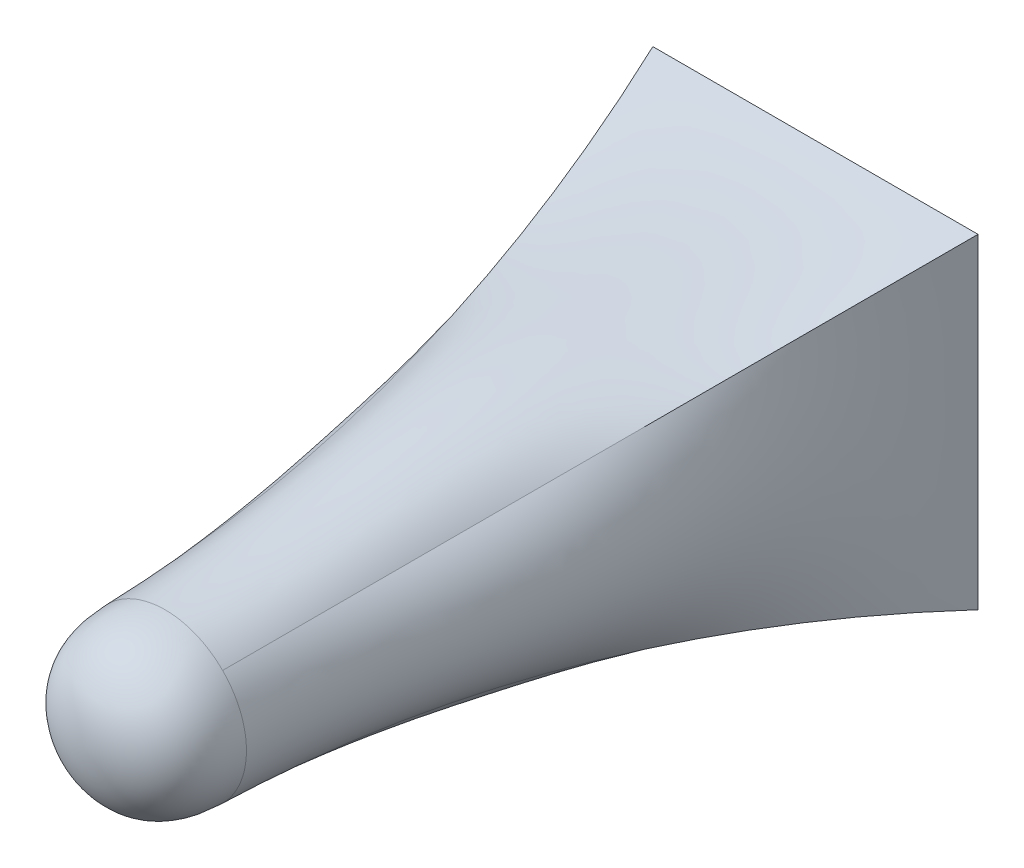
ISO-10303-21;
HEADER;
FILE_DESCRIPTION(('STEP AP214'),'2;1');
FILE_NAME('part.step','',(''),(''),'','','');
FILE_SCHEMA(('AUTOMOTIVE_DESIGN { 1 0 10303 214 1 1 1 1 }'));
ENDSEC;
DATA;
#1=APPLICATION_CONTEXT('core data for automotive mechanical design processes');
#2=APPLICATION_PROTOCOL_DEFINITION('international standard','automotive_design',2000,#1);
#3=PRODUCT_CONTEXT('',#1,'mechanical');
#4=PRODUCT('Part','Part','',(#3));
#5=PRODUCT_RELATED_PRODUCT_CATEGORY('part','',(#4));
#6=PRODUCT_DEFINITION_FORMATION('','',#4);
#7=PRODUCT_DEFINITION_CONTEXT('part definition',#1,'design');
#8=PRODUCT_DEFINITION('design','',#6,#7);
#9=PRODUCT_DEFINITION_SHAPE('','',#8);
#10=(LENGTH_UNIT() NAMED_UNIT(*) SI_UNIT(.MILLI.,.METRE.));
#11=(NAMED_UNIT(*) PLANE_ANGLE_UNIT() SI_UNIT($,.RADIAN.));
#12=(NAMED_UNIT(*) SI_UNIT($,.STERADIAN.) SOLID_ANGLE_UNIT());
#13=UNCERTAINTY_MEASURE_WITH_UNIT(LENGTH_MEASURE(1.E-05),#10,'distance_accuracy_value','');
#14=(GEOMETRIC_REPRESENTATION_CONTEXT(3) GLOBAL_UNCERTAINTY_ASSIGNED_CONTEXT((#13)) GLOBAL_UNIT_ASSIGNED_CONTEXT((#10,
#11,#12)) REPRESENTATION_CONTEXT('',''));
#15=CARTESIAN_POINT('',(0.,0.,0.));
#16=DIRECTION('',(0.,0.,1.));
#17=DIRECTION('',(1.,0.,0.));
#18=AXIS2_PLACEMENT_3D('',#15,#16,#17);
#19=CARTESIAN_POINT('',(0.,0.,0.));
#20=DIRECTION('',(0.,0.,-1.));
#21=DIRECTION('',(-1.,0.,0.));
#22=AXIS2_PLACEMENT_3D('',#19,#20,#21);
#23=PLANE('',#22);
#24=DIRECTION('',(-1.,0.,0.));
#25=VECTOR('',#24,1.);
#26=CARTESIAN_POINT('',(6.35,6.35,0.));
#27=LINE('',#26,#25);
#28=CARTESIAN_POINT('',(6.35,6.35,0.));
#29=VERTEX_POINT('',#28);
#30=CARTESIAN_POINT('',(-6.35,6.35,0.));
#31=VERTEX_POINT('',#30);
#32=EDGE_CURVE('E267',#29,#31,#27,.T.);
#33=ORIENTED_EDGE('',*,*,#32,.F.);
#34=DIRECTION('',(0.,1.,0.));
#35=VECTOR('',#34,1.);
#36=CARTESIAN_POINT('',(6.35,-6.35,0.));
#37=LINE('',#36,#35);
#38=CARTESIAN_POINT('',(6.35,-6.35,0.));
#39=VERTEX_POINT('',#38);
#40=EDGE_CURVE('E249',#39,#29,#37,.T.);
#41=ORIENTED_EDGE('',*,*,#40,.F.);
#42=DIRECTION('',(1.,0.,0.));
#43=VECTOR('',#42,1.);
#44=CARTESIAN_POINT('',(6.35,-6.35,0.));
#45=LINE('',#44,#43);
#46=CARTESIAN_POINT('',(-6.35,-6.35,0.));
#47=VERTEX_POINT('',#46);
#48=EDGE_CURVE('E241',#47,#39,#45,.T.);
#49=ORIENTED_EDGE('',*,*,#48,.F.);
#50=DIRECTION('',(0.,-1.,0.));
#51=VECTOR('',#50,1.);
#52=CARTESIAN_POINT('',(-6.35,-6.35,0.));
#53=LINE('',#52,#51);
#54=EDGE_CURVE('E245',#31,#47,#53,.T.);
#55=ORIENTED_EDGE('',*,*,#54,.F.);
#56=EDGE_LOOP('',(#33,#41,#49,#55));
#57=FACE_BOUND('',#56,.T.);
#58=ADVANCED_FACE('F196',(#57),#23,.T.);
#59=CARTESIAN_POINT('',(6.35,-6.35,0.));
#60=CARTESIAN_POINT('',(5.06127510027064,-5.06127510027064,4.13811489977793));
#61=CARTESIAN_POINT('',(3.07297511203779,-3.07297511203779,12.6044846769102));
#62=CARTESIAN_POINT('',(2.32465112044883,-2.32465112044883,21.0714482331113));
#63=CARTESIAN_POINT('',(2.24506403026729,-2.24506403026729,25.4));
#64=CARTESIAN_POINT('',(6.35,-2.11666666666667,0.));
#65=CARTESIAN_POINT('',(5.06127510027064,-1.68709170009021,4.13811489977793));
#66=CARTESIAN_POINT('',(6.15704233241171,-1.6655502562356,12.6044846769102));
#67=CARTESIAN_POINT('',(3.56373565699179,-1.03250852378484,21.0714482331113));
#68=CARTESIAN_POINT('',(3.48414856681025,-1.00597949372432,25.4));
#69=CARTESIAN_POINT('',(6.35,2.11666666666667,0.));
#70=CARTESIAN_POINT('',(5.06127510027064,1.68709170009021,4.13811489977793));
#71=CARTESIAN_POINT('',(6.15704233241171,1.6655502562356,12.6044846769102));
#72=CARTESIAN_POINT('',(3.56373565699179,1.03250852378484,21.0714482331113));
#73=CARTESIAN_POINT('',(3.48414856681025,1.00597949372432,25.4));
#74=CARTESIAN_POINT('',(6.35,6.35,0.));
#75=CARTESIAN_POINT('',(5.06127510027064,5.06127510027064,4.13811489977793));
#76=CARTESIAN_POINT('',(3.07297511203779,3.07297511203779,12.6044846769102));
#77=CARTESIAN_POINT('',(2.32465112044883,2.32465112044883,21.0714482331113));
#78=CARTESIAN_POINT('',(2.24506403026729,2.24506403026729,25.4));
#79=B_SPLINE_SURFACE_WITH_KNOTS('',3,3,((#59,#60,#61,#62,#63),(#64,#65,#66,#67,#68),(#69,#70,
#71,#72,#73),(#74,#75,#76,#77,#78)),.UNSPECIFIED.,.F.,.F.,.F.,(4,4),(4,1,4),(0.,1.),(0.,
0.50563190115092,1.),.UNSPECIFIED.);
#80=CARTESIAN_POINT('',(6.35,6.35,0.));
#81=CARTESIAN_POINT('',(5.06127510027064,5.06127510027064,4.13811489977793));
#82=CARTESIAN_POINT('',(3.07297511203779,3.07297511203779,12.6044846769102));
#83=CARTESIAN_POINT('',(2.32465112044883,2.32465112044883,21.0714482331113));
#84=CARTESIAN_POINT('',(2.24506403026729,2.24506403026729,25.4));
#85=B_SPLINE_CURVE_WITH_KNOTS('',3,(#80,#81,#82,#83,#84),.UNSPECIFIED.,.F.,.F.,(4,1,4),(0.,
0.50563190115092,1.),.UNSPECIFIED.);
#86=CARTESIAN_POINT('',(2.24522607504589,2.2452260750821,25.4000339324606));
#87=VERTEX_POINT('',#86);
#88=EDGE_CURVE('E274',#29,#87,#85,.T.);
#89=CARTESIAN_POINT('',(0.,0.,25.4));
#90=DIRECTION('',(0.,0.,1.));
#91=DIRECTION('',(1.,0.,0.));
#92=AXIS2_PLACEMENT_3D('',#89,#90,#91);
#93=CIRCLE('',#92,3.175);
#94=CARTESIAN_POINT('',(2.24522607525407,-2.24522607335472,25.4000339324615));
#95=VERTEX_POINT('',#94);
#96=EDGE_CURVE('E209',#95,#87,#93,.T.);
#97=CARTESIAN_POINT('',(6.35,-6.35,0.));
#98=CARTESIAN_POINT('',(5.06127510027064,-5.06127510027064,4.13811489977793));
#99=CARTESIAN_POINT('',(3.07297511203779,-3.07297511203779,12.6044846769102));
#100=CARTESIAN_POINT('',(2.32465112044883,-2.32465112044883,21.0714482331113));
#101=CARTESIAN_POINT('',(2.24506403026729,-2.24506403026729,25.4));
#102=B_SPLINE_CURVE_WITH_KNOTS('',3,(#97,#98,#99,#100,#101),.UNSPECIFIED.,.F.,.F.,(4,1,4),(0.,
0.50563190115092,1.),.UNSPECIFIED.);
#103=EDGE_CURVE('E413',#95,#39,#102,.F.);
#104=ORIENTED_EDGE('',*,*,#40,.T.);
#105=ORIENTED_EDGE('',*,*,#88,.T.);
#106=ORIENTED_EDGE('',*,*,#96,.F.);
#107=ORIENTED_EDGE('',*,*,#103,.T.);
#108=EDGE_LOOP('',(#104,#105,#106,#107));
#109=FACE_BOUND('',#108,.T.);
#110=ADVANCED_FACE('F389',(#109),#79,.T.);
#111=CARTESIAN_POINT('',(6.35,6.35,0.));
#112=CARTESIAN_POINT('',(5.06127510027064,5.06127510027064,4.13811489977793));
#113=CARTESIAN_POINT('',(3.07297511203779,3.07297511203779,12.6044846769102));
#114=CARTESIAN_POINT('',(2.32465112044883,2.32465112044883,21.0714482331113));
#115=CARTESIAN_POINT('',(2.24506403026729,2.24506403026729,25.4));
#116=CARTESIAN_POINT('',(2.11666666666667,6.35,0.));
#117=CARTESIAN_POINT('',(1.68709170009021,5.06127510027064,4.13811489977793));
#118=CARTESIAN_POINT('',(1.6655502562356,6.15704233241171,12.6044846769102));
#119=CARTESIAN_POINT('',(1.03250852378484,3.56373565699179,21.0714482331113));
#120=CARTESIAN_POINT('',(1.00597949372432,3.48414856681025,25.4));
#121=CARTESIAN_POINT('',(-2.11666666666667,6.35,0.));
#122=CARTESIAN_POINT('',(-1.68709170009021,5.06127510027064,4.13811489977793));
#123=CARTESIAN_POINT('',(-1.6655502562356,6.15704233241171,12.6044846769102));
#124=CARTESIAN_POINT('',(-1.03250852378484,3.56373565699179,21.0714482331113));
#125=CARTESIAN_POINT('',(-1.00597949372432,3.48414856681025,25.4));
#126=CARTESIAN_POINT('',(-6.35,6.35,0.));
#127=CARTESIAN_POINT('',(-5.06127510027064,5.06127510027064,4.13811489977793));
#128=CARTESIAN_POINT('',(-3.07297511203779,3.07297511203779,12.6044846769102));
#129=CARTESIAN_POINT('',(-2.32465112044883,2.32465112044883,21.0714482331113));
#130=CARTESIAN_POINT('',(-2.24506403026729,2.24506403026729,25.4));
#131=B_SPLINE_SURFACE_WITH_KNOTS('',3,3,((#111,#112,#113,#114,#115),(#116,#117,#118,#119,#120),
(#121,#122,#123,#124,#125),(#126,#127,#128,#129,#130)),.UNSPECIFIED.,.F.,.F.,.F.,(4,4),(4,1,4),
(0.,1.),(0.,0.50563190115092,1.),.UNSPECIFIED.);
#132=CARTESIAN_POINT('',(-6.35,6.35,0.));
#133=CARTESIAN_POINT('',(-5.06127510027064,5.06127510027064,4.13811489977793));
#134=CARTESIAN_POINT('',(-3.07297511203779,3.07297511203779,12.6044846769102));
#135=CARTESIAN_POINT('',(-2.32465112044883,2.32465112044883,21.0714482331113));
#136=CARTESIAN_POINT('',(-2.24506403026729,2.24506403026729,25.4));
#137=B_SPLINE_CURVE_WITH_KNOTS('',3,(#132,#133,#134,#135,#136),.UNSPECIFIED.,.F.,.F.,(4,1,4),
(0.,0.50563190115092,1.),.UNSPECIFIED.);
#138=CARTESIAN_POINT('',(-2.24522607559809,2.24522607377192,25.4000339324445));
#139=VERTEX_POINT('',#138);
#140=EDGE_CURVE('E266',#31,#139,#137,.T.);
#141=EDGE_CURVE('E217',#87,#139,#93,.T.);
#142=ORIENTED_EDGE('',*,*,#32,.T.);
#143=ORIENTED_EDGE('',*,*,#140,.T.);
#144=ORIENTED_EDGE('',*,*,#141,.F.);
#145=ORIENTED_EDGE('',*,*,#88,.F.);
#146=EDGE_LOOP('',(#142,#143,#144,#145));
#147=FACE_BOUND('',#146,.T.);
#148=ADVANCED_FACE('F301',(#147),#131,.T.);
#149=CARTESIAN_POINT('',(-6.35,-6.35,0.));
#150=CARTESIAN_POINT('',(-5.06127510027064,-5.06127510027063,4.13811489977793));
#151=CARTESIAN_POINT('',(-3.07297511203779,-3.07297511203779,12.6044846769102));
#152=CARTESIAN_POINT('',(-2.32465112044883,-2.32465112044883,21.0714482331113));
#153=CARTESIAN_POINT('',(-2.24506403026729,-2.24506403026729,25.4));
#154=CARTESIAN_POINT('',(-2.11666666666667,-6.35,0.));
#155=CARTESIAN_POINT('',(-1.68709170009021,-5.06127510027064,4.13811489977793));
#156=CARTESIAN_POINT('',(-1.6655502562356,-6.15704233241171,12.6044846769102));
#157=CARTESIAN_POINT('',(-1.03250852378484,-3.56373565699179,21.0714482331113));
#158=CARTESIAN_POINT('',(-1.00597949372432,-3.48414856681025,25.4));
#159=CARTESIAN_POINT('',(2.11666666666667,-6.35,0.));
#160=CARTESIAN_POINT('',(1.68709170009021,-5.06127510027064,4.13811489977793));
#161=CARTESIAN_POINT('',(1.6655502562356,-6.15704233241171,12.6044846769102));
#162=CARTESIAN_POINT('',(1.03250852378484,-3.56373565699179,21.0714482331113));
#163=CARTESIAN_POINT('',(1.00597949372432,-3.48414856681025,25.4));
#164=CARTESIAN_POINT('',(6.35,-6.35,0.));
#165=CARTESIAN_POINT('',(5.06127510027063,-5.06127510027064,4.13811489977793));
#166=CARTESIAN_POINT('',(3.07297511203779,-3.07297511203779,12.6044846769102));
#167=CARTESIAN_POINT('',(2.32465112044883,-2.32465112044883,21.0714482331113));
#168=CARTESIAN_POINT('',(2.24506403026729,-2.24506403026729,25.4));
#169=B_SPLINE_SURFACE_WITH_KNOTS('',3,3,((#149,#150,#151,#152,#153),(#154,#155,#156,#157,#158),
(#159,#160,#161,#162,#163),(#164,#165,#166,#167,#168)),.UNSPECIFIED.,.F.,.F.,.F.,(4,4),(4,1,4),
(0.,1.),(0.,0.50563190115092,1.),.UNSPECIFIED.);
#170=CARTESIAN_POINT('',(-2.24522607471502,-2.24522607468922,25.4000339324672));
#171=VERTEX_POINT('',#170);
#172=EDGE_CURVE('E13',#171,#95,#93,.T.);
#173=CARTESIAN_POINT('',(-6.35,-6.35,0.));
#174=CARTESIAN_POINT('',(-5.06127510027063,-5.06127510027063,4.13811489977793));
#175=CARTESIAN_POINT('',(-3.07297511203779,-3.07297511203779,12.6044846769102));
#176=CARTESIAN_POINT('',(-2.32465112044883,-2.32465112044883,21.0714482331113));
#177=CARTESIAN_POINT('',(-2.24506403026729,-2.24506403026729,25.4));
#178=B_SPLINE_CURVE_WITH_KNOTS('',3,(#173,#174,#175,#176,#177),.UNSPECIFIED.,.F.,.F.,(4,1,4),
(0.,0.50563190115092,1.),.UNSPECIFIED.);
#179=EDGE_CURVE('E263',#47,#171,#178,.T.);
#180=ORIENTED_EDGE('',*,*,#48,.T.);
#181=ORIENTED_EDGE('',*,*,#103,.F.);
#182=ORIENTED_EDGE('',*,*,#172,.F.);
#183=ORIENTED_EDGE('',*,*,#179,.F.);
#184=EDGE_LOOP('',(#180,#181,#182,#183));
#185=FACE_BOUND('',#184,.T.);
#186=ADVANCED_FACE('F271',(#185),#169,.T.);
#187=CARTESIAN_POINT('',(-6.35,6.35,0.));
#188=CARTESIAN_POINT('',(-5.06127510027063,5.06127510027063,4.13811489977793));
#189=CARTESIAN_POINT('',(-3.07297511203779,3.07297511203779,12.6044846769102));
#190=CARTESIAN_POINT('',(-2.32465112044883,2.32465112044883,21.0714482331113));
#191=CARTESIAN_POINT('',(-2.24506403026729,2.24506403026729,25.4));
#192=CARTESIAN_POINT('',(-6.35,2.11666666666667,0.));
#193=CARTESIAN_POINT('',(-5.06127510027063,1.68709170009021,4.13811489977793));
#194=CARTESIAN_POINT('',(-6.15704233241171,1.6655502562356,12.6044846769102));
#195=CARTESIAN_POINT('',(-3.56373565699179,1.03250852378484,21.0714482331113));
#196=CARTESIAN_POINT('',(-3.48414856681025,1.00597949372432,25.4));
#197=CARTESIAN_POINT('',(-6.35,-2.11666666666667,0.));
#198=CARTESIAN_POINT('',(-5.06127510027063,-1.68709170009021,4.13811489977793));
#199=CARTESIAN_POINT('',(-6.15704233241171,-1.6655502562356,12.6044846769102));
#200=CARTESIAN_POINT('',(-3.56373565699179,-1.03250852378484,21.0714482331113));
#201=CARTESIAN_POINT('',(-3.48414856681025,-1.00597949372432,25.4));
#202=CARTESIAN_POINT('',(-6.35,-6.35,0.));
#203=CARTESIAN_POINT('',(-5.06127510027063,-5.06127510027063,4.13811489977793));
#204=CARTESIAN_POINT('',(-3.07297511203779,-3.07297511203779,12.6044846769102));
#205=CARTESIAN_POINT('',(-2.32465112044883,-2.32465112044883,21.0714482331113));
#206=CARTESIAN_POINT('',(-2.24506403026729,-2.24506403026729,25.4));
#207=B_SPLINE_SURFACE_WITH_KNOTS('',3,3,((#187,#188,#189,#190,#191),(#192,#193,#194,#195,#196),
(#197,#198,#199,#200,#201),(#202,#203,#204,#205,#206)),.UNSPECIFIED.,.F.,.F.,.F.,(4,4),(4,1,4),
(0.,1.),(0.,0.50563190115092,1.),.UNSPECIFIED.);
#208=EDGE_CURVE('E203',#139,#171,#93,.T.);
#209=ORIENTED_EDGE('',*,*,#54,.T.);
#210=ORIENTED_EDGE('',*,*,#179,.T.);
#211=ORIENTED_EDGE('',*,*,#208,.F.);
#212=ORIENTED_EDGE('',*,*,#140,.F.);
#213=EDGE_LOOP('',(#209,#210,#211,#212));
#214=FACE_BOUND('',#213,.T.);
#215=ADVANCED_FACE('F262',(#214),#207,.T.);
#216=CARTESIAN_POINT('',(-1.91674954754699,-1.91674946867562,21.7430164258834));
#217=CARTESIAN_POINT('',(-2.3107411641466,-1.93275672883131,23.1160294256766));
#218=CARTESIAN_POINT('',(-2.68315143178553,-1.73286010720643,24.1448412705455));
#219=CARTESIAN_POINT('',(-3.01312627323508,-1.27312107382835,24.8297101759092));
#220=CARTESIAN_POINT('',(-3.33652076663534,1.0959656374343E-08,25.5124199925691));
#221=CARTESIAN_POINT('',(-3.01312625976063,1.27312107603764,24.8297101744448));
#222=CARTESIAN_POINT('',(-2.68315131490556,1.73286006481862,24.1448412697847));
#223=CARTESIAN_POINT('',(-2.3107411526117,1.93275676170954,23.1160294278126));
#224=CARTESIAN_POINT('',(-1.91674946867622,1.91674954754622,21.7430164258835));
#225=CARTESIAN_POINT('',(-1.93275672358053,-2.31074115256527,23.1160294278007));
#226=CARTESIAN_POINT('',(-2.31275738287039,-2.31275731886915,24.4892425639475));
#227=CARTESIAN_POINT('',(-2.68150362269254,-2.07722675639881,25.5176800881751));
#228=CARTESIAN_POINT('',(-3.03083768363417,-1.53221911983736,26.2021368413749));
#229=CARTESIAN_POINT('',(-3.3568260293283,-9.45507036346099E-08,26.8830295112565));
#230=CARTESIAN_POINT('',(-3.03083782687522,1.53221922995311,26.202136841737));
#231=CARTESIAN_POINT('',(-2.68150349387909,2.0772265702431,25.5176800854678));
#232=CARTESIAN_POINT('',(-2.31275724123825,2.31275747972071,24.4892425647613));
#233=CARTESIAN_POINT('',(-1.93275669973967,2.31074116299286,23.1160294259844));
#234=CARTESIAN_POINT('',(-1.73286008400415,-2.68315131577158,24.1448412692471));
#235=CARTESIAN_POINT('',(-2.07722648361967,-2.68150339619089,25.5176800914975));
#236=CARTESIAN_POINT('',(-2.43713026355335,-2.43713032622145,26.5440411999355));
#237=CARTESIAN_POINT('',(-2.76905246860003,-1.80194139606624,27.2282005529064));
#238=CARTESIAN_POINT('',(-3.03718353426663,-7.85144516687087E-08,27.9057015547221));
#239=CARTESIAN_POINT('',(-2.76905233176985,1.80194151715747,27.2282005521477));
#240=CARTESIAN_POINT('',(-2.43713059032852,2.43713017688446,26.5440412042488));
#241=CARTESIAN_POINT('',(-2.07722662823853,2.68150339960888,25.5176800893918));
#242=CARTESIAN_POINT('',(-1.732860112216,2.68315144463243,24.1448412704332));
#243=CARTESIAN_POINT('',(-1.27312110529855,-3.01312627366633,24.8297101735051));
#244=CARTESIAN_POINT('',(-1.53221938285351,-3.03083781751714,26.2021368385524));
#245=CARTESIAN_POINT('',(-1.80194125728825,-2.76905251871637,27.2282005556176));
#246=CARTESIAN_POINT('',(-1.99128258786354,-1.99128256520359,27.9010903276941));
#247=CARTESIAN_POINT('',(-2.20978188125217,4.74666597543845E-08,28.5791466471506));
#248=CARTESIAN_POINT('',(-1.99128276828575,1.99128243592431,27.901090329478));
#249=CARTESIAN_POINT('',(-1.80194099390732,2.76905254622778,27.2282005507225));
#250=CARTESIAN_POINT('',(-1.53221934002412,3.03083777088725,26.2021368409288));
#251=CARTESIAN_POINT('',(-1.27312112339874,3.01312627173149,24.8297101748359));
#252=CARTESIAN_POINT('',(-1.12459054008696E-08,-3.33652073350981,25.5124199950744));
#253=CARTESIAN_POINT('',(1.1383033617706E-07,-3.35682613363693,26.8830295134504));
#254=CARTESIAN_POINT('',(2.16540664557711E-08,-3.03718328258043,27.9057015518663));
#255=CARTESIAN_POINT('',(2.34738688006016E-08,-2.20978203460238,28.5791466477192));
#256=CARTESIAN_POINT('',(-1.19426049436348E-07,-3.23968018891085E-08,29.2406163779276));
#257=CARTESIAN_POINT('',(2.09379323901201E-07,2.20978207122653,28.5791466448794));
#258=CARTESIAN_POINT('',(-3.74969050234301E-07,3.03718332275496,27.9057015577039));
#259=CARTESIAN_POINT('',(6.97829512921633E-08,3.35682606761307,26.8830295103656));
#260=CARTESIAN_POINT('',(5.74841011307411E-08,3.33652075378352,25.5124199939888));
#261=CARTESIAN_POINT('',(1.27312110364092,-3.01312628626235,24.8297101744236));
#262=CARTESIAN_POINT('',(1.53221924366209,-3.03083764638461,26.2021368413659));
#263=CARTESIAN_POINT('',(1.80194121969143,-2.76905263905671,27.2282005515964));
#264=CARTESIAN_POINT('',(1.99128262380886,-1.99128250280014,27.9010903301581));
#265=CARTESIAN_POINT('',(2.20978201843728,-7.04102146912638E-09,28.579146643543));
#266=CARTESIAN_POINT('',(1.9912824816236,1.99128259607652,27.9010903303403));
#267=CARTESIAN_POINT('',(1.80194140611989,2.76905255070228,27.2282005530526));
#268=CARTESIAN_POINT('',(1.53221928246637,3.03083777616819,26.2021368402342));
#269=CARTESIAN_POINT('',(1.27312107371003,3.01312626459038,24.8297101740253));
#270=CARTESIAN_POINT('',(1.7328601251064,-2.68315143009139,24.1448412708509));
#271=CARTESIAN_POINT('',(2.0772267197229,-2.68150356197892,25.5176800886741));
#272=CARTESIAN_POINT('',(2.43713035155378,-2.43713006661489,26.544041203436));
#273=CARTESIAN_POINT('',(2.76905248407809,-1.80194138221106,27.2282005492088));
#274=CARTESIAN_POINT('',(3.03718341899374,8.45077066676855E-08,27.9057015627852));
#275=CARTESIAN_POINT('',(2.76905250012783,1.80194123786724,27.2282005488286));
#276=CARTESIAN_POINT('',(2.43713023397896,2.4371302781988,26.5440412027224));
#277=CARTESIAN_POINT('',(2.07722653014607,2.6815035160278,25.5176800899772));
#278=CARTESIAN_POINT('',(1.73286009449511,2.68315132125415,24.1448412693618));
#279=CARTESIAN_POINT('',(1.93275669070348,-2.31074116419248,23.116029425683));
#280=CARTESIAN_POINT('',(2.31275720098546,-2.31275753681481,24.489242563692));
#281=CARTESIAN_POINT('',(2.68150360357057,-2.07722645267396,25.5176800896088));
#282=CARTESIAN_POINT('',(3.03083775613325,-1.53221933690475,26.2021368420328));
#283=CARTESIAN_POINT('',(3.35682607451408,9.57521230218578E-08,26.8830295069753));
#284=CARTESIAN_POINT('',(3.03083771059703,1.53221922750402,26.2021368432488));
#285=CARTESIAN_POINT('',(2.68150354146867,2.07722663868115,25.5176800894099));
#286=CARTESIAN_POINT('',(2.31275742312407,2.31275737596375,24.489242562477));
#287=CARTESIAN_POINT('',(1.93275673261829,2.31074115376349,23.1160294274999));
#288=CARTESIAN_POINT('',(1.91674946867679,-1.91674954754501,21.7430164258795));
#289=CARTESIAN_POINT('',(2.31074115343546,-1.93275672185017,23.1160294278237));
#290=CARTESIAN_POINT('',(2.68315131881153,-1.7328600875436,24.1448412684048));
#291=CARTESIAN_POINT('',(3.01312626263298,-1.27312113522783,24.8297101743926));
#292=CARTESIAN_POINT('',(3.33652076058392,-1.12833060897857E-08,25.51241999328));
#293=CARTESIAN_POINT('',(3.01312627645398,1.27312113293039,24.8297101755923));
#294=CARTESIAN_POINT('',(2.68315143579185,1.73286013025474,24.1448412696554));
#295=CARTESIAN_POINT('',(2.31074116332493,1.93275668897143,23.1160294256599));
#296=CARTESIAN_POINT('',(1.91674954754933,1.91674946867194,21.7430164258799));
#297=B_SPLINE_SURFACE_WITH_KNOTS('',5,5,((#216,#217,#218,#219,#220,#221,#222,#223,#224),(#225,
#226,#227,#228,#229,#230,#231,#232,#233),(#234,#235,#236,#237,#238,#239,#240,#241,#242),(#243,
#244,#245,#246,#247,#248,#249,#250,#251),(#252,#253,#254,#255,#256,#257,#258,#259,#260),(#261,
#262,#263,#264,#265,#266,#267,#268,#269),(#270,#271,#272,#273,#274,#275,#276,#277,#278),(#279,
#280,#281,#282,#283,#284,#285,#286,#287),(#288,#289,#290,#291,#292,#293,#294,#295,#296)),
.UNSPECIFIED.,.F.,.F.,.F.,(6,3,6),(6,3,6),(-3.28619047866461,3.62376795237651E-13,
3.28619047866533),(-3.28619047866526,5.01376717920721E-13,3.28619047866626),.UNSPECIFIED.);
#298=ORIENTED_EDGE('',*,*,#208,.T.);
#299=ORIENTED_EDGE('',*,*,#172,.T.);
#300=ORIENTED_EDGE('',*,*,#96,.T.);
#301=ORIENTED_EDGE('',*,*,#141,.T.);
#302=EDGE_LOOP('',(#298,#299,#300,#301));
#303=FACE_BOUND('',#302,.T.);
#304=ADVANCED_FACE('F198',(#303),#297,.T.);
#305=CLOSED_SHELL('',(#58,#110,#148,#186,#215,#304));
#306=MANIFOLD_SOLID_BREP('B2',#305);
#307=ADVANCED_BREP_SHAPE_REPRESENTATION('',(#18,#306),#14);
#308=SHAPE_DEFINITION_REPRESENTATION(#9,#307);
ENDSEC;
END-ISO-10303-21;
